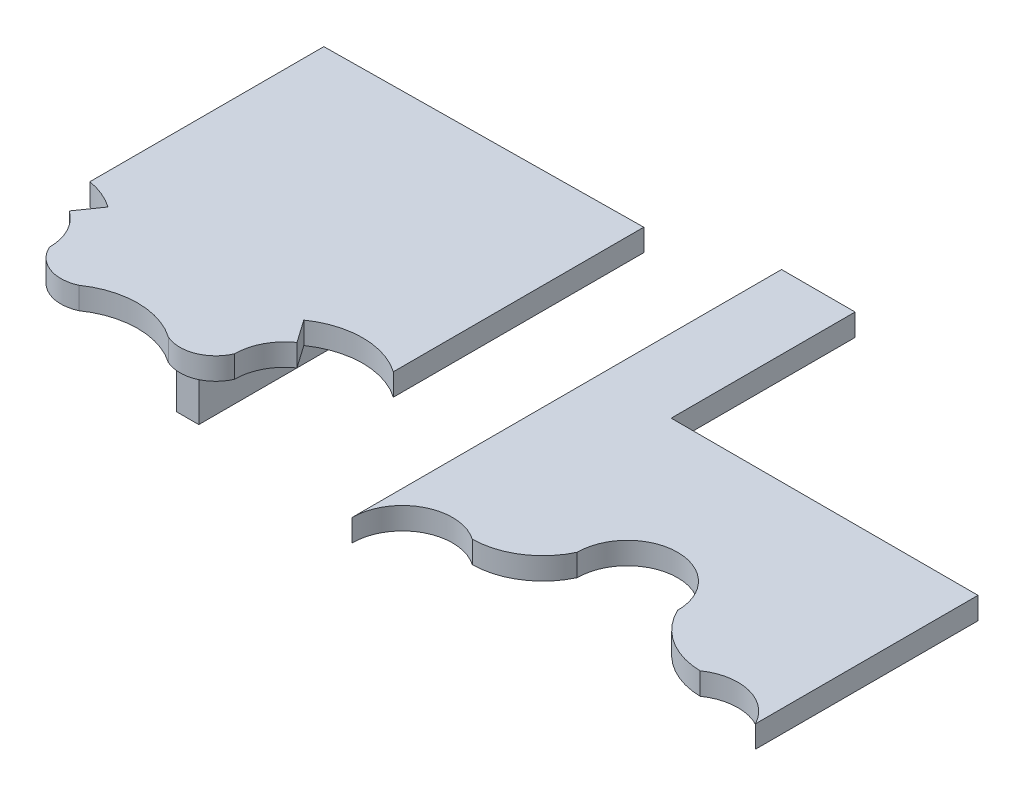
ISO-10303-21;
HEADER;
FILE_DESCRIPTION(('STEP AP214'),'2;1');
FILE_NAME('part.step','',(''),(''),'','','');
FILE_SCHEMA(('AUTOMOTIVE_DESIGN { 1 0 10303 214 1 1 1 1 }'));
ENDSEC;
DATA;
#1=APPLICATION_CONTEXT('core data for automotive mechanical design processes');
#2=APPLICATION_PROTOCOL_DEFINITION('international standard','automotive_design',2000,#1);
#3=PRODUCT_CONTEXT('',#1,'mechanical');
#4=PRODUCT('Part','Part','',(#3));
#5=PRODUCT_RELATED_PRODUCT_CATEGORY('part','',(#4));
#6=PRODUCT_DEFINITION_FORMATION('','',#4);
#7=PRODUCT_DEFINITION_CONTEXT('part definition',#1,'design');
#8=PRODUCT_DEFINITION('design','',#6,#7);
#9=PRODUCT_DEFINITION_SHAPE('','',#8);
#10=(LENGTH_UNIT() NAMED_UNIT(*) SI_UNIT(.MILLI.,.METRE.));
#11=(NAMED_UNIT(*) PLANE_ANGLE_UNIT() SI_UNIT($,.RADIAN.));
#12=(NAMED_UNIT(*) SI_UNIT($,.STERADIAN.) SOLID_ANGLE_UNIT());
#13=UNCERTAINTY_MEASURE_WITH_UNIT(LENGTH_MEASURE(1.E-05),#10,'distance_accuracy_value','');
#14=(GEOMETRIC_REPRESENTATION_CONTEXT(3) GLOBAL_UNCERTAINTY_ASSIGNED_CONTEXT((#13)) GLOBAL_UNIT_ASSIGNED_CONTEXT((#10,
#11,#12)) REPRESENTATION_CONTEXT('',''));
#15=CARTESIAN_POINT('',(0.,0.,0.));
#16=DIRECTION('',(0.,0.,1.));
#17=DIRECTION('',(1.,0.,0.));
#18=AXIS2_PLACEMENT_3D('',#15,#16,#17);
#19=CARTESIAN_POINT('',(-52.7706584422833,3.,-14.9505808166951));
#20=DIRECTION('',(0.,0.,1.));
#21=DIRECTION('',(1.,0.,0.));
#22=AXIS2_PLACEMENT_3D('',#19,#20,#21);
#23=PLANE('',#22);
#24=DIRECTION('',(0.,-1.,0.));
#25=VECTOR('',#24,1.);
#26=CARTESIAN_POINT('',(-42.7706584422833,0.,-14.9505808166951));
#27=LINE('',#26,#25);
#28=CARTESIAN_POINT('',(-42.7706584422833,3.,-14.9505808166951));
#29=VERTEX_POINT('',#28);
#30=CARTESIAN_POINT('',(-42.7706584422833,0.,-14.9505808166951));
#31=VERTEX_POINT('',#30);
#32=EDGE_CURVE('E66',#29,#31,#27,.T.);
#33=ORIENTED_EDGE('',*,*,#32,.F.);
#34=DIRECTION('',(-1.,0.,0.));
#35=VECTOR('',#34,1.);
#36=CARTESIAN_POINT('',(-52.7706584422833,3.,-14.9505808166951));
#37=LINE('',#36,#35);
#38=CARTESIAN_POINT('',(-1.06354068044981,3.,-14.9505808166951));
#39=VERTEX_POINT('',#38);
#40=EDGE_CURVE('E138',#39,#29,#37,.T.);
#41=ORIENTED_EDGE('',*,*,#40,.F.);
#42=DIRECTION('',(0.,-1.,0.));
#43=VECTOR('',#42,1.);
#44=CARTESIAN_POINT('',(-1.06354068044981,3.,-14.9505808166951));
#45=LINE('',#44,#43);
#46=CARTESIAN_POINT('',(-1.06354068044981,0.,-14.9505808166951));
#47=VERTEX_POINT('',#46);
#48=EDGE_CURVE('E133',#39,#47,#45,.T.);
#49=ORIENTED_EDGE('',*,*,#48,.T.);
#50=DIRECTION('',(-1.,0.,0.));
#51=VECTOR('',#50,1.);
#52=CARTESIAN_POINT('',(-52.7706584422833,0.,-14.9505808166951));
#53=LINE('',#52,#51);
#54=EDGE_CURVE('E136',#47,#31,#53,.T.);
#55=ORIENTED_EDGE('',*,*,#54,.T.);
#56=EDGE_LOOP('',(#33,#41,#49,#55));
#57=FACE_BOUND('',#56,.T.);
#58=ADVANCED_FACE('F49',(#57),#23,.F.);
#59=CARTESIAN_POINT('',(-10.8879025986052,3.,3.06369573904676));
#60=DIRECTION('',(0.,-1.,0.));
#61=DIRECTION('',(0.,0.,-1.));
#62=AXIS2_PLACEMENT_3D('',#59,#60,#61);
#63=CYLINDRICAL_SURFACE('',#62,9.7582307417948);
#64=CARTESIAN_POINT('',(-10.8879025986052,0.,3.06369573904676));
#65=DIRECTION('',(0.,1.,0.));
#66=DIRECTION('',(0.,0.,-1.));
#67=AXIS2_PLACEMENT_3D('',#64,#65,#66);
#68=CIRCLE('',#67,9.7582307417948);
#69=CARTESIAN_POINT('',(-19.7143756300778,0.,7.2249985440345));
#70=VERTEX_POINT('',#69);
#71=CARTESIAN_POINT('',(-11.0587476512164,0.,12.8204308065836));
#72=VERTEX_POINT('',#71);
#73=EDGE_CURVE('E12',#70,#72,#68,.T.);
#74=ORIENTED_EDGE('',*,*,#73,.T.);
#75=DIRECTION('',(0.,-1.,0.));
#76=VECTOR('',#75,1.);
#77=CARTESIAN_POINT('',(-11.0587476512164,3.,12.8204308065836));
#78=LINE('',#77,#76);
#79=CARTESIAN_POINT('',(-11.0587476512164,3.,12.8204308065836));
#80=VERTEX_POINT('',#79);
#81=EDGE_CURVE('E191',#80,#72,#78,.T.);
#82=ORIENTED_EDGE('',*,*,#81,.F.);
#83=CARTESIAN_POINT('',(-10.8879025986052,3.,3.06369573904676));
#84=DIRECTION('',(0.,1.,0.));
#85=DIRECTION('',(0.,0.,-1.));
#86=AXIS2_PLACEMENT_3D('',#83,#84,#85);
#87=CIRCLE('',#86,9.7582307417948);
#88=CARTESIAN_POINT('',(-19.7143756300778,3.,7.2249985440345));
#89=VERTEX_POINT('',#88);
#90=EDGE_CURVE('E53',#89,#80,#87,.T.);
#91=ORIENTED_EDGE('',*,*,#90,.F.);
#92=DIRECTION('',(0.,-1.,0.));
#93=VECTOR('',#92,1.);
#94=CARTESIAN_POINT('',(-19.7143756300778,3.,7.2249985440345));
#95=LINE('',#94,#93);
#96=EDGE_CURVE('E156',#89,#70,#95,.T.);
#97=ORIENTED_EDGE('',*,*,#96,.T.);
#98=EDGE_LOOP('',(#74,#82,#91,#97));
#99=FACE_BOUND('',#98,.T.);
#100=ADVANCED_FACE('F190',(#99),#63,.T.);
#101=CARTESIAN_POINT('',(-7.15037737564304,3.,18.4225683202447));
#102=DIRECTION('',(0.,-1.,0.));
#103=DIRECTION('',(0.,0.,-1.));
#104=AXIS2_PLACEMENT_3D('',#101,#102,#103);
#105=CYLINDRICAL_SURFACE('',#104,6.83076151925644);
#106=CARTESIAN_POINT('',(-7.15037737564304,0.,18.4225683202447));
#107=DIRECTION('',(0.,-1.,0.));
#108=DIRECTION('',(0.,0.,-1.));
#109=AXIS2_PLACEMENT_3D('',#106,#107,#108);
#110=CIRCLE('',#109,6.83076151925644);
#111=CARTESIAN_POINT('',(-1.0635406804504,0.,15.3226131626641));
#112=VERTEX_POINT('',#111);
#113=EDGE_CURVE('E58',#72,#112,#110,.T.);
#114=ORIENTED_EDGE('',*,*,#113,.T.);
#115=DIRECTION('',(0.,-1.,0.));
#116=VECTOR('',#115,1.);
#117=CARTESIAN_POINT('',(-1.0635406804504,3.,15.3226131626641));
#118=LINE('',#117,#116);
#119=CARTESIAN_POINT('',(-1.0635406804504,3.,15.3226131626641));
#120=VERTEX_POINT('',#119);
#121=EDGE_CURVE('E134',#120,#112,#118,.T.);
#122=ORIENTED_EDGE('',*,*,#121,.F.);
#123=CARTESIAN_POINT('',(-7.15037737564304,3.,18.4225683202447));
#124=DIRECTION('',(0.,-1.,0.));
#125=DIRECTION('',(0.,0.,-1.));
#126=AXIS2_PLACEMENT_3D('',#123,#124,#125);
#127=CIRCLE('',#126,6.83076151925644);
#128=EDGE_CURVE('E103',#80,#120,#127,.T.);
#129=ORIENTED_EDGE('',*,*,#128,.F.);
#130=ORIENTED_EDGE('',*,*,#81,.T.);
#131=EDGE_LOOP('',(#114,#122,#129,#130));
#132=FACE_BOUND('',#131,.T.);
#133=ADVANCED_FACE('F245',(#132),#105,.F.);
#134=CARTESIAN_POINT('',(-1.06354068044981,3.,-14.9505808166951));
#135=DIRECTION('',(-1.,0.,0.));
#136=DIRECTION('',(0.,0.,1.));
#137=AXIS2_PLACEMENT_3D('',#134,#135,#136);
#138=PLANE('',#137);
#139=DIRECTION('',(0.,0.,-1.));
#140=VECTOR('',#139,1.);
#141=CARTESIAN_POINT('',(-1.06354068044981,0.,-14.9505808166951));
#142=LINE('',#141,#140);
#143=EDGE_CURVE('E129',#112,#47,#142,.T.);
#144=ORIENTED_EDGE('',*,*,#143,.T.);
#145=ORIENTED_EDGE('',*,*,#48,.F.);
#146=DIRECTION('',(0.,0.,-1.));
#147=VECTOR('',#146,1.);
#148=CARTESIAN_POINT('',(-1.06354068044981,3.,-14.9505808166951));
#149=LINE('',#148,#147);
#150=EDGE_CURVE('E163',#120,#39,#149,.T.);
#151=ORIENTED_EDGE('',*,*,#150,.F.);
#152=ORIENTED_EDGE('',*,*,#121,.T.);
#153=EDGE_LOOP('',(#144,#145,#151,#152));
#154=FACE_BOUND('',#153,.T.);
#155=ADVANCED_FACE('F131',(#154),#138,.F.);
#156=CARTESIAN_POINT('',(-52.7706584422833,3.,18.422568320244));
#157=DIRECTION('',(1.,0.,0.));
#158=DIRECTION('',(0.,0.,-1.));
#159=AXIS2_PLACEMENT_3D('',#156,#157,#158);
#160=PLANE('',#159);
#161=DIRECTION('',(0.,0.,1.));
#162=VECTOR('',#161,1.);
#163=CARTESIAN_POINT('',(-52.7706584422833,0.,18.422568320244));
#164=LINE('',#163,#162);
#165=CARTESIAN_POINT('',(-52.7706584422833,0.,-39.9505808166951));
#166=VERTEX_POINT('',#165);
#167=CARTESIAN_POINT('',(-52.7706584422833,0.,18.422568320244));
#168=VERTEX_POINT('',#167);
#169=EDGE_CURVE('E146',#166,#168,#164,.T.);
#170=ORIENTED_EDGE('',*,*,#169,.T.);
#171=DIRECTION('',(0.,-1.,0.));
#172=VECTOR('',#171,1.);
#173=CARTESIAN_POINT('',(-52.7706584422833,3.,18.422568320244));
#174=LINE('',#173,#172);
#175=CARTESIAN_POINT('',(-52.7706584422833,3.,18.422568320244));
#176=VERTEX_POINT('',#175);
#177=EDGE_CURVE('E139',#176,#168,#174,.T.);
#178=ORIENTED_EDGE('',*,*,#177,.F.);
#179=DIRECTION('',(0.,0.,1.));
#180=VECTOR('',#179,1.);
#181=CARTESIAN_POINT('',(-52.7706584422833,3.,18.422568320244));
#182=LINE('',#181,#180);
#183=CARTESIAN_POINT('',(-52.7706584422833,3.,-39.9505808166951));
#184=VERTEX_POINT('',#183);
#185=EDGE_CURVE('E160',#184,#176,#182,.T.);
#186=ORIENTED_EDGE('',*,*,#185,.F.);
#187=DIRECTION('',(0.,1.,0.));
#188=VECTOR('',#187,1.);
#189=CARTESIAN_POINT('',(-52.7706584422833,0.,-39.9505808166951));
#190=LINE('',#189,#188);
#191=EDGE_CURVE('E209',#166,#184,#190,.T.);
#192=ORIENTED_EDGE('',*,*,#191,.F.);
#193=EDGE_LOOP('',(#170,#178,#186,#192));
#194=FACE_BOUND('',#193,.T.);
#195=ADVANCED_FACE('F226',(#194),#160,.F.);
#196=CARTESIAN_POINT('',(-45.9398969230269,3.,18.422568320244));
#197=DIRECTION('',(0.,-1.,0.));
#198=DIRECTION('',(0.,0.,-1.));
#199=AXIS2_PLACEMENT_3D('',#196,#197,#198);
#200=CYLINDRICAL_SURFACE('',#199,6.83076151925648);
#201=CARTESIAN_POINT('',(-45.9398969230269,0.,18.422568320244));
#202=DIRECTION('',(0.,-1.,0.));
#203=DIRECTION('',(0.,0.,-1.));
#204=AXIS2_PLACEMENT_3D('',#201,#202,#203);
#205=CIRCLE('',#204,6.83076151925648);
#206=CARTESIAN_POINT('',(-42.031526647452,0.,12.8204308065839));
#207=VERTEX_POINT('',#206);
#208=EDGE_CURVE('E148',#168,#207,#205,.T.);
#209=ORIENTED_EDGE('',*,*,#208,.T.);
#210=DIRECTION('',(0.,-1.,0.));
#211=VECTOR('',#210,1.);
#212=CARTESIAN_POINT('',(-42.031526647452,3.,12.8204308065839));
#213=LINE('',#212,#211);
#214=CARTESIAN_POINT('',(-42.031526647452,3.,12.8204308065839));
#215=VERTEX_POINT('',#214);
#216=EDGE_CURVE('E179',#215,#207,#213,.T.);
#217=ORIENTED_EDGE('',*,*,#216,.F.);
#218=CARTESIAN_POINT('',(-45.9398969230269,3.,18.422568320244));
#219=DIRECTION('',(0.,-1.,0.));
#220=DIRECTION('',(0.,0.,-1.));
#221=AXIS2_PLACEMENT_3D('',#218,#219,#220);
#222=CIRCLE('',#221,6.83076151925648);
#223=EDGE_CURVE('E158',#176,#215,#222,.T.);
#224=ORIENTED_EDGE('',*,*,#223,.F.);
#225=ORIENTED_EDGE('',*,*,#177,.T.);
#226=EDGE_LOOP('',(#209,#217,#224,#225));
#227=FACE_BOUND('',#226,.T.);
#228=ADVANCED_FACE('F177',(#227),#200,.F.);
#229=CARTESIAN_POINT('',(-42.2023717000631,3.,3.06369573904679));
#230=DIRECTION('',(0.,-1.,0.));
#231=DIRECTION('',(0.,0.,-1.));
#232=AXIS2_PLACEMENT_3D('',#229,#230,#231);
#233=CYLINDRICAL_SURFACE('',#232,9.75823074179486);
#234=CARTESIAN_POINT('',(-42.2023717000631,0.,3.06369573904679));
#235=DIRECTION('',(0.,1.,0.));
#236=DIRECTION('',(0.,0.,1.));
#237=AXIS2_PLACEMENT_3D('',#234,#235,#236);
#238=CIRCLE('',#237,9.75823074179486);
#239=CARTESIAN_POINT('',(-33.3758986685906,0.,7.22499854403454));
#240=VERTEX_POINT('',#239);
#241=EDGE_CURVE('E167',#207,#240,#238,.T.);
#242=ORIENTED_EDGE('',*,*,#241,.T.);
#243=DIRECTION('',(0.,-1.,0.));
#244=VECTOR('',#243,1.);
#245=CARTESIAN_POINT('',(-33.3758986685906,3.,7.22499854403454));
#246=LINE('',#245,#244);
#247=CARTESIAN_POINT('',(-33.3758986685906,3.,7.22499854403454));
#248=VERTEX_POINT('',#247);
#249=EDGE_CURVE('E187',#248,#240,#246,.T.);
#250=ORIENTED_EDGE('',*,*,#249,.F.);
#251=CARTESIAN_POINT('',(-42.2023717000631,3.,3.06369573904679));
#252=DIRECTION('',(0.,1.,0.));
#253=DIRECTION('',(0.,0.,1.));
#254=AXIS2_PLACEMENT_3D('',#251,#252,#253);
#255=CIRCLE('',#254,9.75823074179486);
#256=EDGE_CURVE('E155',#215,#248,#255,.T.);
#257=ORIENTED_EDGE('',*,*,#256,.F.);
#258=ORIENTED_EDGE('',*,*,#216,.T.);
#259=EDGE_LOOP('',(#242,#250,#257,#258));
#260=FACE_BOUND('',#259,.T.);
#261=ADVANCED_FACE('F185',(#260),#233,.T.);
#262=CARTESIAN_POINT('',(-26.5451371493342,3.,7.2249985440345));
#263=DIRECTION('',(0.,-1.,0.));
#264=DIRECTION('',(0.,0.,-1.));
#265=AXIS2_PLACEMENT_3D('',#262,#263,#264);
#266=CYLINDRICAL_SURFACE('',#265,6.8307615192564);
#267=CARTESIAN_POINT('',(-26.5451371493342,0.,7.2249985440345));
#268=DIRECTION('',(0.,-1.,0.));
#269=DIRECTION('',(0.,0.,-1.));
#270=AXIS2_PLACEMENT_3D('',#267,#268,#269);
#271=CIRCLE('',#270,6.8307615192564);
#272=EDGE_CURVE('E112',#240,#70,#271,.T.);
#273=ORIENTED_EDGE('',*,*,#272,.T.);
#274=ORIENTED_EDGE('',*,*,#96,.F.);
#275=CARTESIAN_POINT('',(-26.5451371493342,3.,7.2249985440345));
#276=DIRECTION('',(0.,-1.,0.));
#277=DIRECTION('',(0.,0.,-1.));
#278=AXIS2_PLACEMENT_3D('',#275,#276,#277);
#279=CIRCLE('',#278,6.8307615192564);
#280=EDGE_CURVE('E153',#248,#89,#279,.T.);
#281=ORIENTED_EDGE('',*,*,#280,.F.);
#282=ORIENTED_EDGE('',*,*,#249,.T.);
#283=EDGE_LOOP('',(#273,#274,#281,#282));
#284=FACE_BOUND('',#283,.T.);
#285=ADVANCED_FACE('F254',(#284),#266,.F.);
#286=CARTESIAN_POINT('',(-10.8879025986052,3.,3.06369573904676));
#287=DIRECTION('',(0.,-1.,0.));
#288=DIRECTION('',(0.,0.,-1.));
#289=AXIS2_PLACEMENT_3D('',#286,#287,#288);
#290=PLANE('',#289);
#291=ORIENTED_EDGE('',*,*,#90,.T.);
#292=ORIENTED_EDGE('',*,*,#128,.T.);
#293=ORIENTED_EDGE('',*,*,#150,.T.);
#294=ORIENTED_EDGE('',*,*,#40,.T.);
#295=DIRECTION('',(0.,0.,1.));
#296=VECTOR('',#295,1.);
#297=CARTESIAN_POINT('',(-42.7706584422833,3.,-39.9505808166951));
#298=LINE('',#297,#296);
#299=CARTESIAN_POINT('',(-42.7706584422833,3.,-39.9505808166951));
#300=VERTEX_POINT('',#299);
#301=EDGE_CURVE('E197',#300,#29,#298,.T.);
#302=ORIENTED_EDGE('',*,*,#301,.F.);
#303=DIRECTION('',(1.,0.,0.));
#304=VECTOR('',#303,1.);
#305=CARTESIAN_POINT('',(-52.7706584422833,3.,-39.9505808166951));
#306=LINE('',#305,#304);
#307=EDGE_CURVE('E206',#184,#300,#306,.T.);
#308=ORIENTED_EDGE('',*,*,#307,.F.);
#309=ORIENTED_EDGE('',*,*,#185,.T.);
#310=ORIENTED_EDGE('',*,*,#223,.T.);
#311=ORIENTED_EDGE('',*,*,#256,.T.);
#312=ORIENTED_EDGE('',*,*,#280,.T.);
#313=EDGE_LOOP('',(#291,#292,#293,#294,#302,#308,#309,#310,#311,#312));
#314=FACE_BOUND('',#313,.T.);
#315=ADVANCED_FACE('F51',(#314),#290,.F.);
#316=CARTESIAN_POINT('',(-10.8879025986052,0.,3.06369573904676));
#317=DIRECTION('',(0.,-1.,0.));
#318=DIRECTION('',(0.,0.,-1.));
#319=AXIS2_PLACEMENT_3D('',#316,#317,#318);
#320=PLANE('',#319);
#321=ORIENTED_EDGE('',*,*,#73,.F.);
#322=ORIENTED_EDGE('',*,*,#272,.F.);
#323=ORIENTED_EDGE('',*,*,#241,.F.);
#324=ORIENTED_EDGE('',*,*,#208,.F.);
#325=ORIENTED_EDGE('',*,*,#169,.F.);
#326=DIRECTION('',(-1.,0.,0.));
#327=VECTOR('',#326,1.);
#328=CARTESIAN_POINT('',(-52.7706584422833,0.,-39.9505808166951));
#329=LINE('',#328,#327);
#330=CARTESIAN_POINT('',(-42.7706584422833,0.,-39.9505808166951));
#331=VERTEX_POINT('',#330);
#332=EDGE_CURVE('E203',#331,#166,#329,.T.);
#333=ORIENTED_EDGE('',*,*,#332,.F.);
#334=DIRECTION('',(0.,0.,1.));
#335=VECTOR('',#334,1.);
#336=CARTESIAN_POINT('',(-42.7706584422833,0.,-39.9505808166951));
#337=LINE('',#336,#335);
#338=EDGE_CURVE('E145',#331,#31,#337,.T.);
#339=ORIENTED_EDGE('',*,*,#338,.T.);
#340=ORIENTED_EDGE('',*,*,#54,.F.);
#341=ORIENTED_EDGE('',*,*,#143,.F.);
#342=ORIENTED_EDGE('',*,*,#113,.F.);
#343=EDGE_LOOP('',(#321,#322,#323,#324,#325,#333,#339,#340,#341,#342));
#344=FACE_BOUND('',#343,.T.);
#345=ADVANCED_FACE('F142',(#344),#320,.T.);
#346=CARTESIAN_POINT('',(-42.7706584422833,0.,-39.9505808166951));
#347=DIRECTION('',(-1.,0.,0.));
#348=DIRECTION('',(0.,0.,1.));
#349=AXIS2_PLACEMENT_3D('',#346,#347,#348);
#350=PLANE('',#349);
#351=ORIENTED_EDGE('',*,*,#32,.T.);
#352=ORIENTED_EDGE('',*,*,#338,.F.);
#353=DIRECTION('',(0.,-1.,0.));
#354=VECTOR('',#353,1.);
#355=CARTESIAN_POINT('',(-42.7706584422833,0.,-39.9505808166951));
#356=LINE('',#355,#354);
#357=EDGE_CURVE('E201',#300,#331,#356,.T.);
#358=ORIENTED_EDGE('',*,*,#357,.F.);
#359=ORIENTED_EDGE('',*,*,#301,.T.);
#360=EDGE_LOOP('',(#351,#352,#358,#359));
#361=FACE_BOUND('',#360,.T.);
#362=ADVANCED_FACE('F229',(#361),#350,.F.);
#363=CARTESIAN_POINT('',(0.,0.,-39.9505808166951));
#364=DIRECTION('',(0.,0.,1.));
#365=DIRECTION('',(1.,0.,0.));
#366=AXIS2_PLACEMENT_3D('',#363,#364,#365);
#367=PLANE('',#366);
#368=ORIENTED_EDGE('',*,*,#332,.T.);
#369=ORIENTED_EDGE('',*,*,#191,.T.);
#370=ORIENTED_EDGE('',*,*,#307,.T.);
#371=ORIENTED_EDGE('',*,*,#357,.T.);
#372=EDGE_LOOP('',(#368,#369,#370,#371));
#373=FACE_BOUND('',#372,.T.);
#374=ADVANCED_FACE('F215',(#373),#367,.F.);
#375=CLOSED_SHELL('',(#58,#100,#133,#155,#195,#228,#261,#285,#315,#345,#362,#374));
#376=MANIFOLD_SOLID_BREP('B2',#375);
#377=CARTESIAN_POINT('',(-111.993391282938,3.,7.16037201037149));
#378=DIRECTION('',(0.,-1.,0.));
#379=DIRECTION('',(0.,0.,-1.));
#380=AXIS2_PLACEMENT_3D('',#377,#378,#379);
#381=CYLINDRICAL_SURFACE('',#380,10.6120759317019);
#382=CARTESIAN_POINT('',(-111.993391282938,0.,7.16037201037149));
#383=DIRECTION('',(0.,-1.,0.));
#384=DIRECTION('',(0.,0.,-1.));
#385=AXIS2_PLACEMENT_3D('',#382,#383,#384);
#386=CIRCLE('',#385,10.6120759317019);
#387=CARTESIAN_POINT('',(-110.11703504036,0.,-3.28450438100558));
#388=VERTEX_POINT('',#387);
#389=CARTESIAN_POINT('',(-105.906554587745,0.,-1.53253168323209));
#390=VERTEX_POINT('',#389);
#391=EDGE_CURVE('E469',#388,#390,#386,.T.);
#392=ORIENTED_EDGE('',*,*,#391,.T.);
#393=DIRECTION('',(0.,-1.,0.));
#394=VECTOR('',#393,1.);
#395=CARTESIAN_POINT('',(-105.906554587745,3.,-1.53253168323209));
#396=LINE('',#395,#394);
#397=CARTESIAN_POINT('',(-105.906554587745,3.,-1.53253168323209));
#398=VERTEX_POINT('',#397);
#399=EDGE_CURVE('E47',#398,#390,#396,.T.);
#400=ORIENTED_EDGE('',*,*,#399,.F.);
#401=CARTESIAN_POINT('',(-111.993391282938,3.,7.16037201037149));
#402=DIRECTION('',(0.,-1.,0.));
#403=DIRECTION('',(0.,0.,-1.));
#404=AXIS2_PLACEMENT_3D('',#401,#402,#403);
#405=CIRCLE('',#404,10.6120759317019);
#406=CARTESIAN_POINT('',(-110.11703504036,3.,-3.28450438100558));
#407=VERTEX_POINT('',#406);
#408=EDGE_CURVE('E478',#407,#398,#405,.T.);
#409=ORIENTED_EDGE('',*,*,#408,.F.);
#410=DIRECTION('',(0.,-1.,0.));
#411=VECTOR('',#410,1.);
#412=CARTESIAN_POINT('',(-110.11703504036,3.,-3.28450438100558));
#413=LINE('',#412,#411);
#414=EDGE_CURVE('E502',#407,#388,#413,.T.);
#415=ORIENTED_EDGE('',*,*,#414,.T.);
#416=EDGE_LOOP('',(#392,#400,#409,#415));
#417=FACE_BOUND('',#416,.T.);
#418=ADVANCED_FACE('F338',(#417),#381,.F.);
#419=CARTESIAN_POINT('',(-108.075427433159,3.,1.5649397478222));
#420=DIRECTION('',(0.819152044288989,0.,0.573576436351049));
#421=DIRECTION('',(0.573576436351049,0.,-0.81915204428899));
#422=AXIS2_PLACEMENT_3D('',#419,#420,#421);
#423=PLANE('',#422);
#424=DIRECTION('',(-0.573576436351049,0.,0.81915204428899));
#425=VECTOR('',#424,1.);
#426=CARTESIAN_POINT('',(-108.075427433159,0.,1.5649397478222));
#427=LINE('',#426,#425);
#428=CARTESIAN_POINT('',(-108.075427433159,0.,1.5649397478222));
#429=VERTEX_POINT('',#428);
#430=EDGE_CURVE('E472',#390,#429,#427,.T.);
#431=ORIENTED_EDGE('',*,*,#430,.T.);
#432=DIRECTION('',(0.,-1.,0.));
#433=VECTOR('',#432,1.);
#434=CARTESIAN_POINT('',(-108.075427433159,3.,1.5649397478222));
#435=LINE('',#434,#433);
#436=CARTESIAN_POINT('',(-108.075427433159,3.,1.5649397478222));
#437=VERTEX_POINT('',#436);
#438=EDGE_CURVE('E345',#437,#429,#435,.T.);
#439=ORIENTED_EDGE('',*,*,#438,.F.);
#440=DIRECTION('',(-0.573576436351049,0.,0.81915204428899));
#441=VECTOR('',#440,1.);
#442=CARTESIAN_POINT('',(-108.075427433159,3.,1.5649397478222));
#443=LINE('',#442,#441);
#444=EDGE_CURVE('E481',#398,#437,#443,.T.);
#445=ORIENTED_EDGE('',*,*,#444,.F.);
#446=ORIENTED_EDGE('',*,*,#399,.T.);
#447=EDGE_LOOP('',(#431,#439,#445,#446));
#448=FACE_BOUND('',#447,.T.);
#449=ADVANCED_FACE('F580',(#448),#423,.F.);
#450=CARTESIAN_POINT('',(-111.993391282938,3.,7.16037201037149));
#451=DIRECTION('',(0.,-1.,0.));
#452=DIRECTION('',(0.,0.,-1.));
#453=AXIS2_PLACEMENT_3D('',#450,#451,#452);
#454=CYLINDRICAL_SURFACE('',#453,6.83076151925623);
#455=CARTESIAN_POINT('',(-111.993391282938,0.,7.16037201037149));
#456=DIRECTION('',(0.,-1.,0.));
#457=DIRECTION('',(0.,0.,1.));
#458=AXIS2_PLACEMENT_3D('',#455,#456,#457);
#459=CIRCLE('',#458,6.83076151925623);
#460=CARTESIAN_POINT('',(-105.162629763682,0.,7.16037201037157));
#461=VERTEX_POINT('',#460);
#462=EDGE_CURVE('E505',#429,#461,#459,.T.);
#463=ORIENTED_EDGE('',*,*,#462,.T.);
#464=DIRECTION('',(0.,-1.,0.));
#465=VECTOR('',#464,1.);
#466=CARTESIAN_POINT('',(-105.162629763682,3.,7.16037201037157));
#467=LINE('',#466,#465);
#468=CARTESIAN_POINT('',(-105.162629763682,3.,7.16037201037157));
#469=VERTEX_POINT('',#468);
#470=EDGE_CURVE('E552',#469,#461,#467,.T.);
#471=ORIENTED_EDGE('',*,*,#470,.F.);
#472=CARTESIAN_POINT('',(-111.993391282938,3.,7.16037201037149));
#473=DIRECTION('',(0.,-1.,0.));
#474=DIRECTION('',(0.,0.,1.));
#475=AXIS2_PLACEMENT_3D('',#472,#473,#474);
#476=CIRCLE('',#475,6.83076151925623);
#477=EDGE_CURVE('E483',#437,#469,#476,.T.);
#478=ORIENTED_EDGE('',*,*,#477,.F.);
#479=ORIENTED_EDGE('',*,*,#438,.T.);
#480=EDGE_LOOP('',(#463,#471,#478,#479));
#481=FACE_BOUND('',#480,.T.);
#482=ADVANCED_FACE('F559',(#481),#454,.F.);
#483=CARTESIAN_POINT('',(-100.687800675589,3.,5.21572000168528));
#484=DIRECTION('',(0.,-1.,0.));
#485=DIRECTION('',(0.,0.,-1.));
#486=AXIS2_PLACEMENT_3D('',#483,#484,#485);
#487=CYLINDRICAL_SURFACE('',#486,4.8791153708974);
#488=CARTESIAN_POINT('',(-100.687800675589,0.,5.21572000168528));
#489=DIRECTION('',(0.,1.,0.));
#490=DIRECTION('',(0.,0.,1.));
#491=AXIS2_PLACEMENT_3D('',#488,#489,#490);
#492=CIRCLE('',#491,4.8791153708974);
#493=CARTESIAN_POINT('',(-98.6854682044374,0.,9.66503809297739));
#494=VERTEX_POINT('',#493);
#495=EDGE_CURVE('E507',#461,#494,#492,.T.);
#496=ORIENTED_EDGE('',*,*,#495,.T.);
#497=DIRECTION('',(0.,-1.,0.));
#498=VECTOR('',#497,1.);
#499=CARTESIAN_POINT('',(-98.6854682044374,3.,9.66503809297739));
#500=LINE('',#499,#498);
#501=CARTESIAN_POINT('',(-98.6854682044374,3.,9.66503809297739));
#502=VERTEX_POINT('',#501);
#503=EDGE_CURVE('E549',#502,#494,#500,.T.);
#504=ORIENTED_EDGE('',*,*,#503,.F.);
#505=CARTESIAN_POINT('',(-100.687800675589,3.,5.21572000168528));
#506=DIRECTION('',(0.,1.,0.));
#507=DIRECTION('',(0.,0.,1.));
#508=AXIS2_PLACEMENT_3D('',#505,#506,#507);
#509=CIRCLE('',#508,4.8791153708974);
#510=EDGE_CURVE('E485',#469,#502,#509,.T.);
#511=ORIENTED_EDGE('',*,*,#510,.F.);
#512=ORIENTED_EDGE('',*,*,#470,.T.);
#513=EDGE_LOOP('',(#496,#504,#511,#512));
#514=FACE_BOUND('',#513,.T.);
#515=ADVANCED_FACE('F568',(#514),#487,.T.);
#516=CARTESIAN_POINT('',(-92.5986315092451,3.,18.357941786581));
#517=DIRECTION('',(0.,-1.,0.));
#518=DIRECTION('',(0.,0.,-1.));
#519=AXIS2_PLACEMENT_3D('',#516,#517,#518);
#520=CYLINDRICAL_SURFACE('',#519,10.6120759317019);
#521=CARTESIAN_POINT('',(-92.5986315092451,0.,18.357941786581));
#522=DIRECTION('',(0.,-1.,0.));
#523=DIRECTION('',(0.,0.,-1.));
#524=AXIS2_PLACEMENT_3D('',#521,#522,#523);
#525=CIRCLE('',#524,10.6120759317019);
#526=CARTESIAN_POINT('',(-86.5117948140527,0.,9.6650380929774));
#527=VERTEX_POINT('',#526);
#528=EDGE_CURVE('E509',#494,#527,#525,.T.);
#529=ORIENTED_EDGE('',*,*,#528,.T.);
#530=DIRECTION('',(0.,-1.,0.));
#531=VECTOR('',#530,1.);
#532=CARTESIAN_POINT('',(-86.5117948140527,3.,9.6650380929774));
#533=LINE('',#532,#531);
#534=CARTESIAN_POINT('',(-86.5117948140527,3.,9.6650380929774));
#535=VERTEX_POINT('',#534);
#536=EDGE_CURVE('E546',#535,#527,#533,.T.);
#537=ORIENTED_EDGE('',*,*,#536,.F.);
#538=CARTESIAN_POINT('',(-92.5986315092451,3.,18.357941786581));
#539=DIRECTION('',(0.,-1.,0.));
#540=DIRECTION('',(0.,0.,-1.));
#541=AXIS2_PLACEMENT_3D('',#538,#539,#540);
#542=CIRCLE('',#541,10.6120759317019);
#543=EDGE_CURVE('E487',#502,#535,#542,.T.);
#544=ORIENTED_EDGE('',*,*,#543,.F.);
#545=ORIENTED_EDGE('',*,*,#503,.T.);
#546=EDGE_LOOP('',(#529,#537,#544,#545));
#547=FACE_BOUND('',#546,.T.);
#548=ADVANCED_FACE('F572',(#547),#520,.F.);
#549=CARTESIAN_POINT('',(-84.5094623429011,3.,5.21572000168525));
#550=DIRECTION('',(0.,-1.,0.));
#551=DIRECTION('',(0.,0.,-1.));
#552=AXIS2_PLACEMENT_3D('',#549,#550,#551);
#553=CYLINDRICAL_SURFACE('',#552,4.87911537089744);
#554=CARTESIAN_POINT('',(-84.5094623429011,0.,5.21572000168525));
#555=DIRECTION('',(0.,1.,0.));
#556=DIRECTION('',(0.,0.,1.));
#557=AXIS2_PLACEMENT_3D('',#554,#555,#556);
#558=CIRCLE('',#557,4.87911537089744);
#559=CARTESIAN_POINT('',(-80.0346332548085,0.,7.16037201037166));
#560=VERTEX_POINT('',#559);
#561=EDGE_CURVE('E511',#527,#560,#558,.T.);
#562=ORIENTED_EDGE('',*,*,#561,.T.);
#563=DIRECTION('',(0.,-1.,0.));
#564=VECTOR('',#563,1.);
#565=CARTESIAN_POINT('',(-80.0346332548085,3.,7.16037201037166));
#566=LINE('',#565,#564);
#567=CARTESIAN_POINT('',(-80.0346332548085,3.,7.16037201037166));
#568=VERTEX_POINT('',#567);
#569=EDGE_CURVE('E543',#568,#560,#566,.T.);
#570=ORIENTED_EDGE('',*,*,#569,.F.);
#571=CARTESIAN_POINT('',(-84.5094623429011,3.,5.21572000168525));
#572=DIRECTION('',(0.,1.,0.));
#573=DIRECTION('',(0.,0.,1.));
#574=AXIS2_PLACEMENT_3D('',#571,#572,#573);
#575=CIRCLE('',#574,4.87911537089744);
#576=EDGE_CURVE('E489',#535,#568,#575,.T.);
#577=ORIENTED_EDGE('',*,*,#576,.F.);
#578=ORIENTED_EDGE('',*,*,#536,.T.);
#579=EDGE_LOOP('',(#562,#570,#577,#578));
#580=FACE_BOUND('',#579,.T.);
#581=ADVANCED_FACE('F618',(#580),#553,.T.);
#582=CARTESIAN_POINT('',(-73.2038717355522,3.,7.16037201037153));
#583=DIRECTION('',(0.,-1.,0.));
#584=DIRECTION('',(0.,0.,-1.));
#585=AXIS2_PLACEMENT_3D('',#582,#583,#584);
#586=CYLINDRICAL_SURFACE('',#585,6.83076151925628);
#587=CARTESIAN_POINT('',(-73.2038717355522,0.,7.16037201037153));
#588=DIRECTION('',(0.,-1.,0.));
#589=DIRECTION('',(0.,0.,-1.));
#590=AXIS2_PLACEMENT_3D('',#587,#588,#589);
#591=CIRCLE('',#590,6.83076151925628);
#592=CARTESIAN_POINT('',(-77.1218355853311,0.,1.56493974782216));
#593=VERTEX_POINT('',#592);
#594=EDGE_CURVE('E513',#560,#593,#591,.T.);
#595=ORIENTED_EDGE('',*,*,#594,.T.);
#596=DIRECTION('',(0.,-1.,0.));
#597=VECTOR('',#596,1.);
#598=CARTESIAN_POINT('',(-77.1218355853311,3.,1.56493974782216));
#599=LINE('',#598,#597);
#600=CARTESIAN_POINT('',(-77.1218355853311,3.,1.56493974782216));
#601=VERTEX_POINT('',#600);
#602=EDGE_CURVE('E540',#601,#593,#599,.T.);
#603=ORIENTED_EDGE('',*,*,#602,.F.);
#604=CARTESIAN_POINT('',(-73.2038717355522,3.,7.16037201037153));
#605=DIRECTION('',(0.,-1.,0.));
#606=DIRECTION('',(0.,0.,-1.));
#607=AXIS2_PLACEMENT_3D('',#604,#605,#606);
#608=CIRCLE('',#607,6.83076151925628);
#609=EDGE_CURVE('E491',#568,#601,#608,.T.);
#610=ORIENTED_EDGE('',*,*,#609,.F.);
#611=ORIENTED_EDGE('',*,*,#569,.T.);
#612=EDGE_LOOP('',(#595,#603,#610,#611));
#613=FACE_BOUND('',#612,.T.);
#614=ADVANCED_FACE('F621',(#613),#586,.F.);
#615=CARTESIAN_POINT('',(-77.1218355853311,3.,1.56493974782216));
#616=DIRECTION('',(-0.819152044288996,0.,0.57357643635104));
#617=DIRECTION('',(0.57357643635104,0.,0.819152044288996));
#618=AXIS2_PLACEMENT_3D('',#615,#616,#617);
#619=PLANE('',#618);
#620=DIRECTION('',(-0.57357643635104,0.,-0.819152044288996));
#621=VECTOR('',#620,1.);
#622=CARTESIAN_POINT('',(-77.1218355853311,0.,1.56493974782216));
#623=LINE('',#622,#621);
#624=CARTESIAN_POINT('',(-79.2907084307445,0.,-1.53253168323214));
#625=VERTEX_POINT('',#624);
#626=EDGE_CURVE('E515',#593,#625,#623,.T.);
#627=ORIENTED_EDGE('',*,*,#626,.T.);
#628=DIRECTION('',(0.,-1.,0.));
#629=VECTOR('',#628,1.);
#630=CARTESIAN_POINT('',(-79.2907084307445,3.,-1.53253168323214));
#631=LINE('',#630,#629);
#632=CARTESIAN_POINT('',(-79.2907084307445,3.,-1.53253168323214));
#633=VERTEX_POINT('',#632);
#634=EDGE_CURVE('E537',#633,#625,#631,.T.);
#635=ORIENTED_EDGE('',*,*,#634,.F.);
#636=DIRECTION('',(-0.57357643635104,0.,-0.819152044288996));
#637=VECTOR('',#636,1.);
#638=CARTESIAN_POINT('',(-77.1218355853311,3.,1.56493974782216));
#639=LINE('',#638,#637);
#640=EDGE_CURVE('E493',#601,#633,#639,.T.);
#641=ORIENTED_EDGE('',*,*,#640,.F.);
#642=ORIENTED_EDGE('',*,*,#602,.T.);
#643=EDGE_LOOP('',(#627,#635,#641,#642));
#644=FACE_BOUND('',#643,.T.);
#645=ADVANCED_FACE('F625',(#644),#619,.F.);
#646=CARTESIAN_POINT('',(-73.2038717355523,3.,7.1603720103715));
#647=DIRECTION('',(0.,-1.,0.));
#648=DIRECTION('',(0.,0.,-1.));
#649=AXIS2_PLACEMENT_3D('',#646,#647,#648);
#650=CYLINDRICAL_SURFACE('',#649,10.6120759317019);
#651=CARTESIAN_POINT('',(-73.2038717355523,0.,7.1603720103715));
#652=DIRECTION('',(0.,-1.,0.));
#653=DIRECTION('',(0.,0.,-1.));
#654=AXIS2_PLACEMENT_3D('',#651,#652,#653);
#655=CIRCLE('',#654,10.6120759317019);
#656=CARTESIAN_POINT('',(-67.11703504036,0.,-1.53253168323209));
#657=VERTEX_POINT('',#656);
#658=EDGE_CURVE('E517',#625,#657,#655,.T.);
#659=ORIENTED_EDGE('',*,*,#658,.T.);
#660=DIRECTION('',(0.,-1.,0.));
#661=VECTOR('',#660,1.);
#662=CARTESIAN_POINT('',(-67.11703504036,3.,-1.53253168323209));
#663=LINE('',#662,#661);
#664=CARTESIAN_POINT('',(-67.11703504036,3.,-1.53253168323209));
#665=VERTEX_POINT('',#664);
#666=EDGE_CURVE('E534',#665,#657,#663,.T.);
#667=ORIENTED_EDGE('',*,*,#666,.F.);
#668=CARTESIAN_POINT('',(-73.2038717355523,3.,7.1603720103715));
#669=DIRECTION('',(0.,-1.,0.));
#670=DIRECTION('',(0.,0.,-1.));
#671=AXIS2_PLACEMENT_3D('',#668,#669,#670);
#672=CIRCLE('',#671,10.6120759317019);
#673=EDGE_CURVE('E495',#633,#665,#672,.T.);
#674=ORIENTED_EDGE('',*,*,#673,.F.);
#675=ORIENTED_EDGE('',*,*,#634,.T.);
#676=EDGE_LOOP('',(#659,#667,#674,#675));
#677=FACE_BOUND('',#676,.T.);
#678=ADVANCED_FACE('F629',(#677),#650,.F.);
#679=CARTESIAN_POINT('',(-67.11703504036,3.,-35.5690898708294));
#680=DIRECTION('',(-1.,0.,0.));
#681=DIRECTION('',(0.,0.,1.));
#682=AXIS2_PLACEMENT_3D('',#679,#680,#681);
#683=PLANE('',#682);
#684=DIRECTION('',(0.,0.,-1.));
#685=VECTOR('',#684,1.);
#686=CARTESIAN_POINT('',(-67.11703504036,0.,-35.5690898708294));
#687=LINE('',#686,#685);
#688=CARTESIAN_POINT('',(-67.11703504036,0.,-35.5690898708294));
#689=VERTEX_POINT('',#688);
#690=EDGE_CURVE('E520',#657,#689,#687,.T.);
#691=ORIENTED_EDGE('',*,*,#690,.T.);
#692=DIRECTION('',(0.,-1.,0.));
#693=VECTOR('',#692,1.);
#694=CARTESIAN_POINT('',(-67.11703504036,3.,-35.5690898708294));
#695=LINE('',#694,#693);
#696=CARTESIAN_POINT('',(-67.11703504036,3.,-35.5690898708294));
#697=VERTEX_POINT('',#696);
#698=EDGE_CURVE('E531',#697,#689,#695,.T.);
#699=ORIENTED_EDGE('',*,*,#698,.F.);
#700=DIRECTION('',(0.,0.,-1.));
#701=VECTOR('',#700,1.);
#702=CARTESIAN_POINT('',(-67.11703504036,3.,-15.0152073503574));
#703=LINE('',#702,#701);
#704=EDGE_CURVE('E497',#665,#697,#703,.T.);
#705=ORIENTED_EDGE('',*,*,#704,.F.);
#706=ORIENTED_EDGE('',*,*,#666,.T.);
#707=EDGE_LOOP('',(#691,#699,#705,#706));
#708=FACE_BOUND('',#707,.T.);
#709=ADVANCED_FACE('F633',(#708),#683,.F.);
#710=CARTESIAN_POINT('',(-110.11703504036,3.,-35.0831938789886));
#711=DIRECTION('',(0.0112991854254298,0.,0.999936162166727));
#712=DIRECTION('',(0.999936162166726,0.,-0.0112991854254298));
#713=AXIS2_PLACEMENT_3D('',#710,#711,#712);
#714=PLANE('',#713);
#715=DIRECTION('',(-0.999936162166726,0.,0.0112991854254298));
#716=VECTOR('',#715,1.);
#717=CARTESIAN_POINT('',(-110.11703504036,0.,-35.0831938789886));
#718=LINE('',#717,#716);
#719=CARTESIAN_POINT('',(-110.11703504036,0.,-35.0831938789886));
#720=VERTEX_POINT('',#719);
#721=EDGE_CURVE('E522',#689,#720,#718,.T.);
#722=ORIENTED_EDGE('',*,*,#721,.T.);
#723=DIRECTION('',(0.,-1.,0.));
#724=VECTOR('',#723,1.);
#725=CARTESIAN_POINT('',(-110.11703504036,3.,-35.0831938789886));
#726=LINE('',#725,#724);
#727=CARTESIAN_POINT('',(-110.11703504036,3.,-35.0831938789886));
#728=VERTEX_POINT('',#727);
#729=EDGE_CURVE('E528',#728,#720,#726,.T.);
#730=ORIENTED_EDGE('',*,*,#729,.F.);
#731=DIRECTION('',(-0.999936162166726,0.,0.0112991854254298));
#732=VECTOR('',#731,1.);
#733=CARTESIAN_POINT('',(-110.11703504036,3.,-35.0831938789886));
#734=LINE('',#733,#732);
#735=EDGE_CURVE('E499',#697,#728,#734,.T.);
#736=ORIENTED_EDGE('',*,*,#735,.F.);
#737=ORIENTED_EDGE('',*,*,#698,.T.);
#738=EDGE_LOOP('',(#722,#730,#736,#737));
#739=FACE_BOUND('',#738,.T.);
#740=ADVANCED_FACE('F637',(#739),#714,.F.);
#741=CARTESIAN_POINT('',(-110.11703504036,3.,-3.28450438100558));
#742=DIRECTION('',(1.,0.,0.));
#743=DIRECTION('',(0.,0.,-1.));
#744=AXIS2_PLACEMENT_3D('',#741,#742,#743);
#745=PLANE('',#744);
#746=ORIENTED_EDGE('',*,*,#729,.T.);
#747=DIRECTION('',(0.,1.,0.));
#748=VECTOR('',#747,1.);
#749=CARTESIAN_POINT('',(-110.11703504036,-30.,-35.0831938789886));
#750=LINE('',#749,#748);
#751=CARTESIAN_POINT('',(-110.11703504036,-30.,-35.0831938789886));
#752=VERTEX_POINT('',#751);
#753=EDGE_CURVE('E589',#752,#720,#750,.T.);
#754=ORIENTED_EDGE('',*,*,#753,.F.);
#755=DIRECTION('',(0.,0.,-1.));
#756=VECTOR('',#755,1.);
#757=CARTESIAN_POINT('',(-110.11703504036,-30.,-35.0831938789886));
#758=LINE('',#757,#756);
#759=CARTESIAN_POINT('',(-110.11703504036,-30.,-15.0831938789886));
#760=VERTEX_POINT('',#759);
#761=EDGE_CURVE('E461',#760,#752,#758,.T.);
#762=ORIENTED_EDGE('',*,*,#761,.F.);
#763=DIRECTION('',(0.,1.,0.));
#764=VECTOR('',#763,1.);
#765=CARTESIAN_POINT('',(-110.11703504036,-30.,-15.0831938789886));
#766=LINE('',#765,#764);
#767=CARTESIAN_POINT('',(-110.11703504036,0.,-15.0831938789886));
#768=VERTEX_POINT('',#767);
#769=EDGE_CURVE('E474',#760,#768,#766,.T.);
#770=ORIENTED_EDGE('',*,*,#769,.T.);
#771=DIRECTION('',(0.,0.,1.));
#772=VECTOR('',#771,1.);
#773=CARTESIAN_POINT('',(-110.11703504036,0.,-3.28450438100558));
#774=LINE('',#773,#772);
#775=EDGE_CURVE('E358',#768,#388,#774,.T.);
#776=ORIENTED_EDGE('',*,*,#775,.T.);
#777=ORIENTED_EDGE('',*,*,#414,.F.);
#778=DIRECTION('',(0.,0.,1.));
#779=VECTOR('',#778,1.);
#780=CARTESIAN_POINT('',(-110.11703504036,3.,-15.0831938789886));
#781=LINE('',#780,#779);
#782=EDGE_CURVE('E501',#728,#407,#781,.T.);
#783=ORIENTED_EDGE('',*,*,#782,.F.);
#784=EDGE_LOOP('',(#746,#754,#762,#770,#776,#777,#783));
#785=FACE_BOUND('',#784,.T.);
#786=ADVANCED_FACE('F585',(#785),#745,.F.);
#787=CARTESIAN_POINT('',(-111.993391282938,3.,7.16037201037149));
#788=DIRECTION('',(0.,-1.,0.));
#789=DIRECTION('',(0.,0.,-1.));
#790=AXIS2_PLACEMENT_3D('',#787,#788,#789);
#791=PLANE('',#790);
#792=ORIENTED_EDGE('',*,*,#408,.T.);
#793=ORIENTED_EDGE('',*,*,#444,.T.);
#794=ORIENTED_EDGE('',*,*,#477,.T.);
#795=ORIENTED_EDGE('',*,*,#510,.T.);
#796=ORIENTED_EDGE('',*,*,#543,.T.);
#797=ORIENTED_EDGE('',*,*,#576,.T.);
#798=ORIENTED_EDGE('',*,*,#609,.T.);
#799=ORIENTED_EDGE('',*,*,#640,.T.);
#800=ORIENTED_EDGE('',*,*,#673,.T.);
#801=ORIENTED_EDGE('',*,*,#704,.T.);
#802=ORIENTED_EDGE('',*,*,#735,.T.);
#803=ORIENTED_EDGE('',*,*,#782,.T.);
#804=EDGE_LOOP('',(#792,#793,#794,#795,#796,#797,#798,#799,#800,#801,#802,#803));
#805=FACE_BOUND('',#804,.T.);
#806=ADVANCED_FACE('F576',(#805),#791,.F.);
#807=CARTESIAN_POINT('',(-111.993391282938,0.,7.16037201037149));
#808=DIRECTION('',(0.,-1.,0.));
#809=DIRECTION('',(0.,0.,-1.));
#810=AXIS2_PLACEMENT_3D('',#807,#808,#809);
#811=PLANE('',#810);
#812=DIRECTION('',(1.,0.,0.));
#813=VECTOR('',#812,1.);
#814=CARTESIAN_POINT('',(-110.11703504036,0.,-35.0831938789886));
#815=LINE('',#814,#813);
#816=CARTESIAN_POINT('',(-107.11703504036,0.,-35.0831938789886));
#817=VERTEX_POINT('',#816);
#818=EDGE_CURVE('E468',#720,#817,#815,.T.);
#819=ORIENTED_EDGE('',*,*,#818,.F.);
#820=ORIENTED_EDGE('',*,*,#721,.F.);
#821=ORIENTED_EDGE('',*,*,#690,.F.);
#822=ORIENTED_EDGE('',*,*,#658,.F.);
#823=ORIENTED_EDGE('',*,*,#626,.F.);
#824=ORIENTED_EDGE('',*,*,#594,.F.);
#825=ORIENTED_EDGE('',*,*,#561,.F.);
#826=ORIENTED_EDGE('',*,*,#528,.F.);
#827=ORIENTED_EDGE('',*,*,#495,.F.);
#828=ORIENTED_EDGE('',*,*,#462,.F.);
#829=ORIENTED_EDGE('',*,*,#430,.F.);
#830=ORIENTED_EDGE('',*,*,#391,.F.);
#831=ORIENTED_EDGE('',*,*,#775,.F.);
#832=DIRECTION('',(-1.,0.,0.));
#833=VECTOR('',#832,1.);
#834=CARTESIAN_POINT('',(-110.11703504036,0.,-15.0831938789886));
#835=LINE('',#834,#833);
#836=CARTESIAN_POINT('',(-107.11703504036,0.,-15.0831938789886));
#837=VERTEX_POINT('',#836);
#838=EDGE_CURVE('E465',#837,#768,#835,.T.);
#839=ORIENTED_EDGE('',*,*,#838,.F.);
#840=DIRECTION('',(0.,0.,1.));
#841=VECTOR('',#840,1.);
#842=CARTESIAN_POINT('',(-107.11703504036,0.,-35.0831938789886));
#843=LINE('',#842,#841);
#844=EDGE_CURVE('E352',#817,#837,#843,.T.);
#845=ORIENTED_EDGE('',*,*,#844,.F.);
#846=EDGE_LOOP('',(#819,#820,#821,#822,#823,#824,#825,#826,#827,#828,#829,#830,#831,#839,#845));
#847=FACE_BOUND('',#846,.T.);
#848=ADVANCED_FACE('F563',(#847),#811,.T.);
#849=CARTESIAN_POINT('',(-110.11703504036,-30.,-35.0831938789886));
#850=DIRECTION('',(0.,0.,1.));
#851=DIRECTION('',(1.,0.,0.));
#852=AXIS2_PLACEMENT_3D('',#849,#850,#851);
#853=PLANE('',#852);
#854=ORIENTED_EDGE('',*,*,#818,.T.);
#855=DIRECTION('',(0.,1.,0.));
#856=VECTOR('',#855,1.);
#857=CARTESIAN_POINT('',(-107.11703504036,-30.,-35.0831938789886));
#858=LINE('',#857,#856);
#859=CARTESIAN_POINT('',(-107.11703504036,-30.,-35.0831938789886));
#860=VERTEX_POINT('',#859);
#861=EDGE_CURVE('E449',#860,#817,#858,.T.);
#862=ORIENTED_EDGE('',*,*,#861,.F.);
#863=DIRECTION('',(1.,0.,0.));
#864=VECTOR('',#863,1.);
#865=CARTESIAN_POINT('',(-110.11703504036,-30.,-35.0831938789886));
#866=LINE('',#865,#864);
#867=EDGE_CURVE('E456',#752,#860,#866,.T.);
#868=ORIENTED_EDGE('',*,*,#867,.F.);
#869=ORIENTED_EDGE('',*,*,#753,.T.);
#870=EDGE_LOOP('',(#854,#862,#868,#869));
#871=FACE_BOUND('',#870,.T.);
#872=ADVANCED_FACE('F467',(#871),#853,.F.);
#873=CARTESIAN_POINT('',(-107.11703504036,-30.,-35.0831938789886));
#874=DIRECTION('',(-1.,0.,0.));
#875=DIRECTION('',(0.,0.,1.));
#876=AXIS2_PLACEMENT_3D('',#873,#874,#875);
#877=PLANE('',#876);
#878=ORIENTED_EDGE('',*,*,#844,.T.);
#879=DIRECTION('',(0.,1.,0.));
#880=VECTOR('',#879,1.);
#881=CARTESIAN_POINT('',(-107.11703504036,-30.,-15.0831938789886));
#882=LINE('',#881,#880);
#883=CARTESIAN_POINT('',(-107.11703504036,-30.,-15.0831938789886));
#884=VERTEX_POINT('',#883);
#885=EDGE_CURVE('E452',#884,#837,#882,.T.);
#886=ORIENTED_EDGE('',*,*,#885,.F.);
#887=DIRECTION('',(0.,0.,1.));
#888=VECTOR('',#887,1.);
#889=CARTESIAN_POINT('',(-107.11703504036,-30.,-35.0831938789886));
#890=LINE('',#889,#888);
#891=EDGE_CURVE('E445',#860,#884,#890,.T.);
#892=ORIENTED_EDGE('',*,*,#891,.F.);
#893=ORIENTED_EDGE('',*,*,#861,.T.);
#894=EDGE_LOOP('',(#878,#886,#892,#893));
#895=FACE_BOUND('',#894,.T.);
#896=ADVANCED_FACE('F447',(#895),#877,.F.);
#897=CARTESIAN_POINT('',(-110.11703504036,-30.,-15.0831938789886));
#898=DIRECTION('',(0.,0.,-1.));
#899=DIRECTION('',(-1.,0.,0.));
#900=AXIS2_PLACEMENT_3D('',#897,#898,#899);
#901=PLANE('',#900);
#902=ORIENTED_EDGE('',*,*,#838,.T.);
#903=ORIENTED_EDGE('',*,*,#769,.F.);
#904=DIRECTION('',(-1.,0.,0.));
#905=VECTOR('',#904,1.);
#906=CARTESIAN_POINT('',(-110.11703504036,-30.,-15.0831938789886));
#907=LINE('',#906,#905);
#908=EDGE_CURVE('E455',#884,#760,#907,.T.);
#909=ORIENTED_EDGE('',*,*,#908,.F.);
#910=ORIENTED_EDGE('',*,*,#885,.T.);
#911=EDGE_LOOP('',(#902,#903,#909,#910));
#912=FACE_BOUND('',#911,.T.);
#913=ADVANCED_FACE('F596',(#912),#901,.F.);
#914=CARTESIAN_POINT('',(0.,-30.,0.));
#915=DIRECTION('',(0.,-1.,0.));
#916=DIRECTION('',(0.,0.,-1.));
#917=AXIS2_PLACEMENT_3D('',#914,#915,#916);
#918=PLANE('',#917);
#919=ORIENTED_EDGE('',*,*,#867,.T.);
#920=ORIENTED_EDGE('',*,*,#891,.T.);
#921=ORIENTED_EDGE('',*,*,#908,.T.);
#922=ORIENTED_EDGE('',*,*,#761,.T.);
#923=EDGE_LOOP('',(#919,#920,#921,#922));
#924=FACE_BOUND('',#923,.T.);
#925=ADVANCED_FACE('F459',(#924),#918,.T.);
#926=CLOSED_SHELL('',(#418,#449,#482,#515,#548,#581,#614,#645,#678,#709,#740,#786,#806,#848,
#872,#896,#913,#925));
#927=MANIFOLD_SOLID_BREP('B6',#926);
#928=ADVANCED_BREP_SHAPE_REPRESENTATION('',(#18,#376,#927),#14);
#929=SHAPE_DEFINITION_REPRESENTATION(#9,#928);
ENDSEC;
END-ISO-10303-21;
